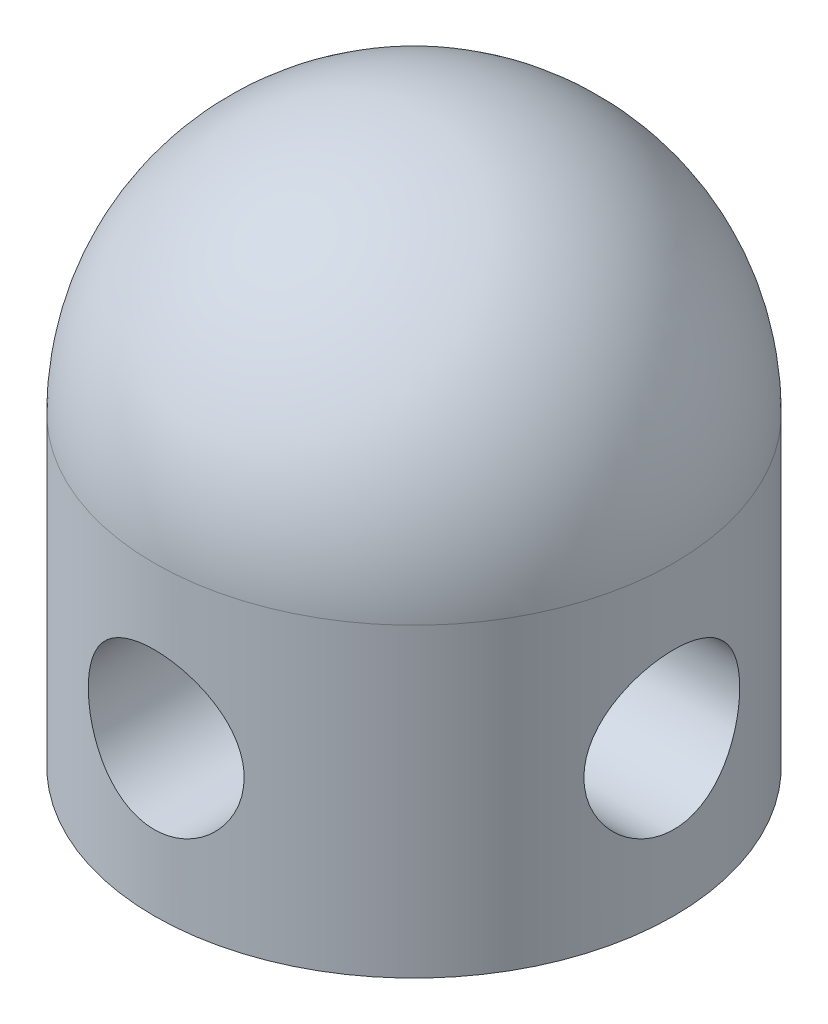
ISO-10303-21;
HEADER;
FILE_DESCRIPTION(('STEP AP214'),'2;1');
FILE_NAME('part.step','',(''),(''),'','','');
FILE_SCHEMA(('AUTOMOTIVE_DESIGN { 1 0 10303 214 1 1 1 1 }'));
ENDSEC;
DATA;
#1=APPLICATION_CONTEXT('core data for automotive mechanical design processes');
#2=APPLICATION_PROTOCOL_DEFINITION('international standard','automotive_design',2000,#1);
#3=PRODUCT_CONTEXT('',#1,'mechanical');
#4=PRODUCT('Part','Part','',(#3));
#5=PRODUCT_RELATED_PRODUCT_CATEGORY('part','',(#4));
#6=PRODUCT_DEFINITION_FORMATION('','',#4);
#7=PRODUCT_DEFINITION_CONTEXT('part definition',#1,'design');
#8=PRODUCT_DEFINITION('design','',#6,#7);
#9=PRODUCT_DEFINITION_SHAPE('','',#8);
#10=(LENGTH_UNIT() NAMED_UNIT(*) SI_UNIT(.MILLI.,.METRE.));
#11=(NAMED_UNIT(*) PLANE_ANGLE_UNIT() SI_UNIT($,.RADIAN.));
#12=(NAMED_UNIT(*) SI_UNIT($,.STERADIAN.) SOLID_ANGLE_UNIT());
#13=UNCERTAINTY_MEASURE_WITH_UNIT(LENGTH_MEASURE(1.E-05),#10,'distance_accuracy_value','');
#14=(GEOMETRIC_REPRESENTATION_CONTEXT(3) GLOBAL_UNCERTAINTY_ASSIGNED_CONTEXT((#13)) GLOBAL_UNIT_ASSIGNED_CONTEXT((#10,
#11,#12)) REPRESENTATION_CONTEXT('',''));
#15=CARTESIAN_POINT('',(0.,0.,0.));
#16=DIRECTION('',(0.,0.,1.));
#17=DIRECTION('',(1.,0.,0.));
#18=AXIS2_PLACEMENT_3D('',#15,#16,#17);
#19=CARTESIAN_POINT('',(0.,20.,0.));
#20=DIRECTION('',(0.,-1.,0.));
#21=DIRECTION('',(0.,0.,-1.));
#22=AXIS2_PLACEMENT_3D('',#19,#20,#21);
#23=CYLINDRICAL_SURFACE('',#22,17.);
#24=CARTESIAN_POINT('',(16.2169664240881,10.,-5.10000000000006));
#25=CARTESIAN_POINT('',(16.2169693147474,9.72053853699297,-5.09999651955021));
#26=CARTESIAN_POINT('',(16.2242692671164,9.44104263790955,-5.07695167768347));
#27=CARTESIAN_POINT('',(16.2525636622905,8.89022215138816,-4.98561871118894));
#28=CARTESIAN_POINT('',(16.2735626807757,8.61890032589522,-4.91731546950155));
#29=CARTESIAN_POINT('',(16.3266674845136,8.09248192387591,-4.73799361117869));
#30=CARTESIAN_POINT('',(16.3587547879105,7.83735917924745,-4.62704603940437));
#31=CARTESIAN_POINT('',(16.4303957066167,7.34928542441603,-4.3658183452096));
#32=CARTESIAN_POINT('',(16.4699504393945,7.11633774047293,-4.21553233465984));
#33=CARTESIAN_POINT('',(16.5534733143162,6.67185427203691,-3.87480164081538));
#34=CARTESIAN_POINT('',(16.5975354825956,6.46112394698262,-3.68332904397749));
#35=CARTESIAN_POINT('',(16.6843053058497,6.07423096550347,-3.26786320777069));
#36=CARTESIAN_POINT('',(16.7270127861219,5.89807275247041,-3.04386579456784));
#37=CARTESIAN_POINT('',(16.8073292956992,5.58182682056676,-2.5639788884986));
#38=CARTESIAN_POINT('',(16.8448146276417,5.44256035689445,-2.30752567254183));
#39=CARTESIAN_POINT('',(16.9093708213033,5.20944331925463,-1.77352379425586));
#40=CARTESIAN_POINT('',(16.9364439288429,5.11558295048468,-1.49597969651896));
#41=CARTESIAN_POINT('',(16.976459964122,4.97860799629227,-0.93610109894488));
#42=CARTESIAN_POINT('',(16.9897849505574,4.93411856598081,-0.654130756442985));
#43=CARTESIAN_POINT('',(17.0021488510459,4.89280109620211,-0.0864342007477273));
#44=CARTESIAN_POINT('',(17.0011907657169,4.89596304603335,0.199291210971204));
#45=CARTESIAN_POINT('',(16.9853665298002,4.94893575304626,0.756741932440475));
#46=CARTESIAN_POINT('',(16.9709442869781,4.99725765895348,1.02862330998046));
#47=CARTESIAN_POINT('',(16.9303517518289,5.13674654238066,1.56022332570457));
#48=CARTESIAN_POINT('',(16.9041807155228,5.22791623320535,1.81994119249776));
#49=CARTESIAN_POINT('',(16.8424175135539,5.45152087962283,2.32338090959415));
#50=CARTESIAN_POINT('',(16.8067191689971,5.58442408954371,2.56688121996063));
#51=CARTESIAN_POINT('',(16.7296877820452,5.88735269825698,3.02859989086321));
#52=CARTESIAN_POINT('',(16.688353403725,6.0573869040796,3.2468122345672));
#53=CARTESIAN_POINT('',(16.6025927165555,6.43747235255154,3.66064563719917));
#54=CARTESIAN_POINT('',(16.5581086407696,6.64881352468632,3.85507157335578));
#55=CARTESIAN_POINT('',(16.4724553163351,7.10153406084096,4.20606015236189));
#56=CARTESIAN_POINT('',(16.4312863973771,7.34291640637865,4.36261903244663));
#57=CARTESIAN_POINT('',(16.3566487081151,7.85201419540269,4.63467584138164));
#58=CARTESIAN_POINT('',(16.3232575613944,8.11995995574973,4.74976563397936));
#59=CARTESIAN_POINT('',(16.2688773443844,8.67266450852362,4.93283433776251));
#60=CARTESIAN_POINT('',(16.2478842285429,8.95741778315959,5.00082861775135));
#61=CARTESIAN_POINT('',(16.2215648849761,9.52428002655414,5.0855421896179));
#62=CARTESIAN_POINT('',(16.2156838749486,9.8060919612504,5.10407817693366));
#63=CARTESIAN_POINT('',(16.2187205428718,10.3688078600227,5.09442220591754));
#64=CARTESIAN_POINT('',(16.2276361492834,10.649711945682,5.06623678862344));
#65=CARTESIAN_POINT('',(16.2587169909066,11.1950604851038,4.96555596152409));
#66=CARTESIAN_POINT('',(16.2805320012653,11.4597429584967,4.89423068866392));
#67=CARTESIAN_POINT('',(16.3345908018511,11.97336574877,4.71065164342945));
#68=CARTESIAN_POINT('',(16.3668362022056,12.2223036280777,4.59839155165364));
#69=CARTESIAN_POINT('',(16.4391983907866,12.7047593778455,4.33268362068108));
#70=CARTESIAN_POINT('',(16.479503216374,12.9376840513517,4.17821118187276));
#71=CARTESIAN_POINT('',(16.5630389919968,13.3749695610147,3.83368025441299));
#72=CARTESIAN_POINT('',(16.6062706408199,13.5793235398835,3.64361324818642));
#73=CARTESIAN_POINT('',(16.6927635406376,13.9616133797701,3.22474745047819));
#74=CARTESIAN_POINT('',(16.7359643321422,14.1382611385557,2.99475762391522));
#75=CARTESIAN_POINT('',(16.8158849594541,14.4504867834944,2.50737006760678));
#76=CARTESIAN_POINT('',(16.8526051170804,14.586066709257,2.24997369984935));
#77=CARTESIAN_POINT('',(16.9152029961486,14.8110001039322,1.71678071599769));
#78=CARTESIAN_POINT('',(16.9411614164488,14.9006988549405,1.4411397149286));
#79=CARTESIAN_POINT('',(16.9796673062922,15.0322071242274,0.877777886115537));
#80=CARTESIAN_POINT('',(16.9922186128101,15.0740303442246,0.590060539006121));
#81=CARTESIAN_POINT('',(17.0022624987674,15.1075583497853,0.0226173232012794));
#82=CARTESIAN_POINT('',(17.0003163737844,15.1011311643867,-0.256989608893115));
#83=CARTESIAN_POINT('',(16.9829069918118,15.0428064495029,-0.810966235959078));
#84=CARTESIAN_POINT('',(16.9674445012379,14.9909114981663,-1.08533622697843));
#85=CARTESIAN_POINT('',(16.924899724181,14.8442803512415,-1.61818176434051));
#86=CARTESIAN_POINT('',(16.8979439986215,14.7500101857942,-1.87679635299416));
#87=CARTESIAN_POINT('',(16.8352000633492,14.5217214906747,-2.37467300835767));
#88=CARTESIAN_POINT('',(16.7994104023277,14.3876964290238,-2.61393188657438));
#89=CARTESIAN_POINT('',(16.7213348381292,14.0787302447412,-3.07462643422755));
#90=CARTESIAN_POINT('',(16.6788777152854,13.9026171380099,-3.29524685025187));
#91=CARTESIAN_POINT('',(16.592800265335,13.516584679656,-3.70442774258546));
#92=CARTESIAN_POINT('',(16.5491796062288,13.3066555910995,-3.89297895268098));
#93=CARTESIAN_POINT('',(16.4641831410189,12.8514413537876,-4.23831315938304));
#94=CARTESIAN_POINT('',(16.4229129898929,12.6052889186445,-4.3939818316433));
#95=CARTESIAN_POINT('',(16.3489866136246,12.089112408027,-4.66154665985053));
#96=CARTESIAN_POINT('',(16.3163262518719,11.8190998798043,-4.77346384891451));
#97=CARTESIAN_POINT('',(16.2665457687777,11.2928825325027,-4.94026604614784));
#98=CARTESIAN_POINT('',(16.2481292646796,11.038330600425,-5.00000120638931));
#99=CARTESIAN_POINT('',(16.2233394482018,10.522528243524,-5.07986584038757));
#100=CARTESIAN_POINT('',(16.2169637215005,10.2612791722088,-5.10000325400526));
#101=CARTESIAN_POINT('',(16.2169664240881,10.,-5.10000000000006));
#102=B_SPLINE_CURVE_WITH_KNOTS('',3,(#24,#25,#26,#27,#28,#29,#30,#31,#32,#33,#34,#35,#36,#37,
#38,#39,#40,#41,#42,#43,#44,#45,#46,#47,#48,#49,#50,#51,#52,#53,#54,#55,#56,#57,#58,#59,#60,#61,
#62,#63,#64,#65,#66,#67,#68,#69,#70,#71,#72,#73,#74,#75,#76,#77,#78,#79,#80,#81,#82,#83,#84,#85,
#86,#87,#88,#89,#90,#91,#92,#93,#94,#95,#96,#97,#98,#99,#100,#101),.UNSPECIFIED.,.T.,.F.,(4,2,2,
2,2,2,2,2,2,2,2,2,2,2,2,2,2,2,2,2,2,2,2,2,2,2,2,2,2,2,2,2,2,2,2,2,2,2,4),(0.,0.837420564112844,
1.6751209817426,2.51143180918506,3.34786788625834,4.20828710027145,5.06881682762327,
5.94714193530391,6.82527748998781,7.67829276508496,8.53112883944897,9.35680428368992,
10.1825320202728,11.017877117413,11.8534205640882,12.7211729987914,13.5890116247233,
14.4651721004139,15.3410465214545,16.1842747469591,17.0273849297397,17.8485922280083,
18.6699263556453,19.5133048816078,20.3568854816719,21.232303207509,22.1076774491114,
22.9763633217756,23.8448005190257,24.67979433307,25.5147408037122,26.340721293744,
27.1668375727954,28.0193873199412,28.8721829895048,29.7503957488581,30.6281857949063,
31.4112792312854,32.1942156312733),.UNSPECIFIED.);
#103=CARTESIAN_POINT('',(16.2169664240881,10.,-5.10000000000006));
#104=VERTEX_POINT('',#103);
#105=EDGE_CURVE('E10',#104,#104,#102,.T.);
#106=ORIENTED_EDGE('',*,*,#105,.T.);
#107=EDGE_LOOP('',(#106));
#108=FACE_BOUND('',#107,.T.);
#109=CARTESIAN_POINT('',(0.,15.1,-17.));
#110=CARTESIAN_POINT('',(-0.279781283361213,15.0999966085514,-16.9999975945186));
#111=CARTESIAN_POINT('',(-0.559596882395174,15.0769008636785,-16.9930271335941));
#112=CARTESIAN_POINT('',(-1.11107962603662,14.9853473956448,-16.9659015901859));
#113=CARTESIAN_POINT('',(-1.38274431499892,14.9168761427205,-16.9457425752509));
#114=CARTESIAN_POINT('',(-1.90989120636529,14.7370635425052,-16.8944487850611));
#115=CARTESIAN_POINT('',(-2.16539663894391,14.6257854432961,-16.8633302085095));
#116=CARTESIAN_POINT('',(-2.654122215581,14.3637772836097,-16.7933517140849));
#117=CARTESIAN_POINT('',(-2.8873393893982,14.2130419748537,-16.7544907665489));
#118=CARTESIAN_POINT('',(-3.33156411042338,13.8718383745949,-16.6719250645352));
#119=CARTESIAN_POINT('',(-3.54184144222564,13.6804434719952,-16.6281210442669));
#120=CARTESIAN_POINT('',(-3.92784731139813,13.2653286182981,-16.5411983632274));
#121=CARTESIAN_POINT('',(-4.10357003515212,13.041603238748,-16.4980798189033));
#122=CARTESIAN_POINT('',(-4.41932128258908,12.561999439696,-16.4163598755112));
#123=CARTESIAN_POINT('',(-4.558458506686,12.3055112327279,-16.3778818255282));
#124=CARTESIAN_POINT('',(-4.79132742227216,11.7714365357169,-16.3112830923696));
#125=CARTESIAN_POINT('',(-4.88507001726103,11.4938551306756,-16.2831599224074));
#126=CARTESIAN_POINT('',(-5.02185554522633,10.9336730951322,-16.2414896087455));
#127=CARTESIAN_POINT('',(-5.06624467198061,10.6514306708506,-16.2275563570039));
#128=CARTESIAN_POINT('',(-5.10726684089727,10.083187268875,-16.2146948515223));
#129=CARTESIAN_POINT('',(-5.10391145388652,9.79718721862276,-16.2157629622189));
#130=CARTESIAN_POINT('',(-5.05059722478317,9.2404947106987,-16.2324412979583));
#131=CARTESIAN_POINT('',(-5.00232497888911,8.96962234867081,-16.2475252110391));
#132=CARTESIAN_POINT('',(-4.86327229447819,8.44001272657822,-16.2896841104336));
#133=CARTESIAN_POINT('',(-4.77248766080649,8.18127666690593,-16.3167602801381));
#134=CARTESIAN_POINT('',(-4.54974490623814,7.67915881118311,-16.3802729249148));
#135=CARTESIAN_POINT('',(-4.41723977578132,7.43603591456006,-16.4168325480405));
#136=CARTESIAN_POINT('',(-4.11519756801175,6.9749111251574,-16.495133557904));
#137=CARTESIAN_POINT('',(-3.94565151608705,6.75691533999098,-16.5368761993709));
#138=CARTESIAN_POINT('',(-3.56596388602956,6.34266695141139,-16.6229743841578));
#139=CARTESIAN_POINT('',(-3.35442268538797,6.14770254229972,-16.6673662465644));
#140=CARTESIAN_POINT('',(-2.90109508166722,5.79571645418095,-16.7522162981433));
#141=CARTESIAN_POINT('',(-2.65930677632695,5.63869716339079,-16.7926742396239));
#142=CARTESIAN_POINT('',(-2.1500071303656,5.36627626362008,-16.865467442364));
#143=CARTESIAN_POINT('',(-1.88233434914305,5.25116044475052,-16.8977464847232));
#144=CARTESIAN_POINT('',(-1.33023441305195,5.06796139366121,-16.950139742295));
#145=CARTESIAN_POINT('',(-1.04581195540457,4.99986504298952,-16.9702573503578));
#146=CARTESIAN_POINT('',(-0.479237625072331,4.91478259514207,-16.9955243978804));
#147=CARTESIAN_POINT('',(-0.197370331844035,4.89605060827453,-17.0011849142049));
#148=CARTESIAN_POINT('',(0.365498659799505,4.90533512942107,-16.9983993902198));
#149=CARTESIAN_POINT('',(0.646500468748656,4.9333453968149,-16.9899552330437));
#150=CARTESIAN_POINT('',(1.19307225805297,5.03390767777909,-16.9602436975635));
#151=CARTESIAN_POINT('',(1.45884742688818,5.10543951777496,-16.9392702131801));
#152=CARTESIAN_POINT('',(1.97456577244537,5.28978699144588,-16.8869278266122));
#153=CARTESIAN_POINT('',(2.22450704188699,5.40260758752873,-16.8555576749172));
#154=CARTESIAN_POINT('',(2.70788644416758,5.66926076263585,-16.7847682479447));
#155=CARTESIAN_POINT('',(2.94080900907887,5.82398175922313,-16.7451795482078));
#156=CARTESIAN_POINT('',(3.37797924713251,6.16896416377954,-16.662497937988));
#157=CARTESIAN_POINT('',(3.5822197100102,6.35923448041801,-16.6194041506611));
#158=CARTESIAN_POINT('',(3.96391531473489,6.77811684845585,-16.5326078435461));
#159=CARTESIAN_POINT('',(4.14012836187102,7.00787037762421,-16.4889400511137));
#160=CARTESIAN_POINT('',(4.45158583245331,7.49463499264571,-16.4076015181251));
#161=CARTESIAN_POINT('',(4.5868313302024,7.75164536349679,-16.3699306203231));
#162=CARTESIAN_POINT('',(4.81158980232337,8.28481047026707,-16.3052844468473));
#163=CARTESIAN_POINT('',(4.90131579585836,8.56086903422863,-16.2782594864495));
#164=CARTESIAN_POINT('',(5.0327388477152,9.1251390943628,-16.2381142085755));
#165=CARTESIAN_POINT('',(5.07445236528343,9.41334639066233,-16.2249891261796));
#166=CARTESIAN_POINT('',(5.10754747248881,9.98082916252063,-16.2145990640065));
#167=CARTESIAN_POINT('',(5.10095388047007,10.259976413568,-16.2166960099067));
#168=CARTESIAN_POINT('',(5.04245518510638,10.8129879515621,-16.2349796406672));
#169=CARTESIAN_POINT('',(4.99055189623993,11.0868524496137,-16.2511657613103));
#170=CARTESIAN_POINT('',(4.84421421934766,11.6182143570477,-16.2953759656171));
#171=CARTESIAN_POINT('',(4.75031596724221,11.8758727770196,-16.3232505547839));
#172=CARTESIAN_POINT('',(4.5230712421165,12.3719842919905,-16.3876694826895));
#173=CARTESIAN_POINT('',(4.38971721873728,12.6104336999814,-16.4242154805464));
#174=CARTESIAN_POINT('',(4.08165796937298,13.0707545961893,-16.5035209985408));
#175=CARTESIAN_POINT('',(3.90562338716193,13.2917057882846,-16.5464583655859));
#176=CARTESIAN_POINT('',(3.51959277741244,13.7015884942475,-16.6328448952841));
#177=CARTESIAN_POINT('',(3.30958793825726,13.8905116741906,-16.6762941880082));
#178=CARTESIAN_POINT('',(2.85418359142308,14.2364796018029,-16.7603318434067));
#179=CARTESIAN_POINT('',(2.60792881168807,14.3924309193086,-16.8007994320342));
#180=CARTESIAN_POINT('',(2.09148067154399,14.6604995776737,-16.8728631354964));
#181=CARTESIAN_POINT('',(1.82129858019644,14.7726374201333,-16.904463397656));
#182=CARTESIAN_POINT('',(1.29457622302796,14.9398439372193,-16.9524739489565));
#183=CARTESIAN_POINT('',(1.0396756706444,14.999739687803,-16.9701489309564));
#184=CARTESIAN_POINT('',(0.523192663784646,15.0798159858214,-16.9939121128127));
#185=CARTESIAN_POINT('',(0.261611333517667,15.1000031711964,-17.0000022492612));
#186=CARTESIAN_POINT('',(0.,15.1,-17.));
#187=B_SPLINE_CURVE_WITH_KNOTS('',3,(#109,#110,#111,#112,#113,#114,#115,#116,#117,#118,#119,
#120,#121,#122,#123,#124,#125,#126,#127,#128,#129,#130,#131,#132,#133,#134,#135,#136,#137,#138,
#139,#140,#141,#142,#143,#144,#145,#146,#147,#148,#149,#150,#151,#152,#153,#154,#155,#156,#157,
#158,#159,#160,#161,#162,#163,#164,#165,#166,#167,#168,#169,#170,#171,#172,#173,#174,#175,#176,
#177,#178,#179,#180,#181,#182,#183,#184,#185,#186),.UNSPECIFIED.,.T.,.F.,(4,2,2,2,2,2,2,2,2,2,2,
2,2,2,2,2,2,2,2,2,2,2,2,2,2,2,2,2,2,2,2,2,2,2,2,2,2,2,4),(0.,0.838382892282875,1.6770158804764,
2.51441449942297,3.35192455900318,4.21109050023851,5.07040086781352,5.94903035415395,
6.82744869450187,7.68126943815663,8.5348832628813,9.3576845677823,10.1805670844594,
11.0147224992894,11.8490802454782,12.718281537725,13.5875375221437,14.4626155940647,
15.3374494200668,16.1808995209979,17.0242370207984,17.8485293872864,18.6729208562741,
19.5163843939862,20.3600595880938,21.2343736110631,22.1086647046785,22.9788257084299,
23.8486883217369,24.6823052860425,25.5158888687368,26.3391213739349,27.162511517048,
28.01589547336,28.8695011467574,29.7480618695692,30.6262109944804,31.410277525878,
32.1942129765041),.UNSPECIFIED.);
#188=CARTESIAN_POINT('',(0.,15.1,-17.));
#189=VERTEX_POINT('',#188);
#190=EDGE_CURVE('E38',#189,#189,#187,.T.);
#191=ORIENTED_EDGE('',*,*,#190,.T.);
#192=EDGE_LOOP('',(#191));
#193=FACE_BOUND('',#192,.T.);
#194=CARTESIAN_POINT('',(-16.216966424088,10.,5.10000000000017));
#195=CARTESIAN_POINT('',(-16.2169693147474,9.72053853699297,5.09999651955033));
#196=CARTESIAN_POINT('',(-16.2242692671164,9.44104263790955,5.07695167768359));
#197=CARTESIAN_POINT('',(-16.2525636622905,8.89022215138816,4.98561871118906));
#198=CARTESIAN_POINT('',(-16.2735626807757,8.61890032589522,4.91731546950167));
#199=CARTESIAN_POINT('',(-16.3266674845136,8.09248192387591,4.73799361117881));
#200=CARTESIAN_POINT('',(-16.3587547879104,7.83735917924745,4.62704603940449));
#201=CARTESIAN_POINT('',(-16.4303957066167,7.34928542441603,4.36581834520972));
#202=CARTESIAN_POINT('',(-16.4699504393945,7.11633774047292,4.21553233465995));
#203=CARTESIAN_POINT('',(-16.5534733143161,6.67185427203691,3.8748016408155));
#204=CARTESIAN_POINT('',(-16.5975354825956,6.46112394698262,3.6833290439776));
#205=CARTESIAN_POINT('',(-16.6843053058497,6.07423096550347,3.26786320777081));
#206=CARTESIAN_POINT('',(-16.7270127861219,5.89807275247041,3.04386579456795));
#207=CARTESIAN_POINT('',(-16.8073292956992,5.58182682056676,2.56397888849872));
#208=CARTESIAN_POINT('',(-16.8448146276417,5.44256035689445,2.30752567254195));
#209=CARTESIAN_POINT('',(-16.9093708213033,5.20944331925463,1.77352379425598));
#210=CARTESIAN_POINT('',(-16.9364439288428,5.11558295048467,1.49597969651908));
#211=CARTESIAN_POINT('',(-16.976459964122,4.97860799629227,0.936101098945));
#212=CARTESIAN_POINT('',(-16.9897849505574,4.93411856598081,0.654130756443105));
#213=CARTESIAN_POINT('',(-17.0021488510459,4.89280109620211,0.0864342007478476));
#214=CARTESIAN_POINT('',(-17.0011907657169,4.89596304603335,-0.199291210971084));
#215=CARTESIAN_POINT('',(-16.9853665298002,4.94893575304626,-0.756741932440355));
#216=CARTESIAN_POINT('',(-16.9709442869781,4.99725765895348,-1.02862330998034));
#217=CARTESIAN_POINT('',(-16.9303517518289,5.13674654238066,-1.56022332570445));
#218=CARTESIAN_POINT('',(-16.9041807155228,5.22791623320535,-1.81994119249764));
#219=CARTESIAN_POINT('',(-16.8424175135539,5.45152087962283,-2.32338090959403));
#220=CARTESIAN_POINT('',(-16.8067191689972,5.58442408954371,-2.56688121996051));
#221=CARTESIAN_POINT('',(-16.7296877820453,5.88735269825698,-3.02859989086309));
#222=CARTESIAN_POINT('',(-16.6883534037251,6.05738690407959,-3.24681223456708));
#223=CARTESIAN_POINT('',(-16.6025927165555,6.43747235255154,-3.66064563719905));
#224=CARTESIAN_POINT('',(-16.5581086407696,6.64881352468632,-3.85507157335567));
#225=CARTESIAN_POINT('',(-16.4724553163351,7.10153406084096,-4.20606015236177));
#226=CARTESIAN_POINT('',(-16.4312863973772,7.34291640637865,-4.36261903244651));
#227=CARTESIAN_POINT('',(-16.3566487081152,7.85201419540269,-4.63467584138152));
#228=CARTESIAN_POINT('',(-16.3232575613944,8.11995995574973,-4.74976563397925));
#229=CARTESIAN_POINT('',(-16.2688773443845,8.67266450852362,-4.9328343377624));
#230=CARTESIAN_POINT('',(-16.2478842285429,8.95741778315959,-5.00082861775123));
#231=CARTESIAN_POINT('',(-16.2215648849761,9.52428002655414,-5.08554218961778));
#232=CARTESIAN_POINT('',(-16.2156838749487,9.8060919612504,-5.10407817693355));
#233=CARTESIAN_POINT('',(-16.2187205428719,10.3688078600227,-5.09442220591743));
#234=CARTESIAN_POINT('',(-16.2276361492834,10.649711945682,-5.06623678862333));
#235=CARTESIAN_POINT('',(-16.2587169909067,11.1950604851038,-4.96555596152397));
#236=CARTESIAN_POINT('',(-16.2805320012653,11.4597429584967,-4.89423068866381));
#237=CARTESIAN_POINT('',(-16.3345908018512,11.97336574877,-4.71065164342934));
#238=CARTESIAN_POINT('',(-16.3668362022057,12.2223036280777,-4.59839155165353));
#239=CARTESIAN_POINT('',(-16.4391983907866,12.7047593778455,-4.33268362068096));
#240=CARTESIAN_POINT('',(-16.479503216374,12.9376840513517,-4.17821118187264));
#241=CARTESIAN_POINT('',(-16.5630389919968,13.3749695610147,-3.83368025441287));
#242=CARTESIAN_POINT('',(-16.6062706408199,13.5793235398835,-3.6436132481863));
#243=CARTESIAN_POINT('',(-16.6927635406376,13.9616133797701,-3.22474745047807));
#244=CARTESIAN_POINT('',(-16.7359643321422,14.1382611385557,-2.99475762391511));
#245=CARTESIAN_POINT('',(-16.8158849594541,14.4504867834944,-2.50737006760667));
#246=CARTESIAN_POINT('',(-16.8526051170804,14.586066709257,-2.24997369984923));
#247=CARTESIAN_POINT('',(-16.9152029961486,14.8110001039322,-1.71678071599758));
#248=CARTESIAN_POINT('',(-16.9411614164488,14.9006988549405,-1.44113971492848));
#249=CARTESIAN_POINT('',(-16.9796673062922,15.0322071242274,-0.87777788611542));
#250=CARTESIAN_POINT('',(-16.9922186128101,15.0740303442246,-0.590060539006004));
#251=CARTESIAN_POINT('',(-17.0022624987674,15.1075583497853,-0.0226173232011619));
#252=CARTESIAN_POINT('',(-17.0003163737844,15.1011311643867,0.256989608893232));
#253=CARTESIAN_POINT('',(-16.9829069918118,15.0428064495029,0.810966235959195));
#254=CARTESIAN_POINT('',(-16.9674445012379,14.9909114981663,1.08533622697854));
#255=CARTESIAN_POINT('',(-16.9248997241809,14.8442803512415,1.61818176434062));
#256=CARTESIAN_POINT('',(-16.8979439986215,14.7500101857942,1.87679635299428));
#257=CARTESIAN_POINT('',(-16.8352000633492,14.5217214906747,2.37467300835778));
#258=CARTESIAN_POINT('',(-16.7994104023277,14.3876964290238,2.61393188657449));
#259=CARTESIAN_POINT('',(-16.7213348381292,14.0787302447412,3.07462643422766));
#260=CARTESIAN_POINT('',(-16.6788777152854,13.9026171380099,3.29524685025199));
#261=CARTESIAN_POINT('',(-16.592800265335,13.516584679656,3.70442774258557));
#262=CARTESIAN_POINT('',(-16.5491796062288,13.3066555910995,3.89297895268109));
#263=CARTESIAN_POINT('',(-16.4641831410189,12.8514413537876,4.23831315938315));
#264=CARTESIAN_POINT('',(-16.4229129898929,12.6052889186445,4.39398183164342));
#265=CARTESIAN_POINT('',(-16.3489866136246,12.089112408027,4.66154665985064));
#266=CARTESIAN_POINT('',(-16.3163262518718,11.8190998798043,4.77346384891463));
#267=CARTESIAN_POINT('',(-16.2665457687776,11.2928825325027,4.94026604614795));
#268=CARTESIAN_POINT('',(-16.2481292646795,11.038330600425,5.00000120638943));
#269=CARTESIAN_POINT('',(-16.2233394482017,10.522528243524,5.07986584038768));
#270=CARTESIAN_POINT('',(-16.2169637215004,10.2612791722088,5.10000325400537));
#271=CARTESIAN_POINT('',(-16.216966424088,10.,5.10000000000017));
#272=B_SPLINE_CURVE_WITH_KNOTS('',3,(#194,#195,#196,#197,#198,#199,#200,#201,#202,#203,#204,
#205,#206,#207,#208,#209,#210,#211,#212,#213,#214,#215,#216,#217,#218,#219,#220,#221,#222,#223,
#224,#225,#226,#227,#228,#229,#230,#231,#232,#233,#234,#235,#236,#237,#238,#239,#240,#241,#242,
#243,#244,#245,#246,#247,#248,#249,#250,#251,#252,#253,#254,#255,#256,#257,#258,#259,#260,#261,
#262,#263,#264,#265,#266,#267,#268,#269,#270,#271),.UNSPECIFIED.,.T.,.F.,(4,2,2,2,2,2,2,2,2,2,2,
2,2,2,2,2,2,2,2,2,2,2,2,2,2,2,2,2,2,2,2,2,2,2,2,2,2,2,4),(0.,0.837420564112842,1.6751209817426,
2.51143180918506,3.34786788625834,4.20828710027145,5.06881682762327,5.94714193530391,
6.82527748998781,7.67829276508496,8.53112883944897,9.35680428368992,10.1825320202728,
11.017877117413,11.8534205640882,12.7211729987914,13.5890116247233,14.4651721004139,
15.3410465214545,16.1842747469591,17.0273849297397,17.8485922280083,18.6699263556453,
19.5133048816078,20.3568854816719,21.232303207509,22.1076774491114,22.9763633217756,
23.8448005190258,24.67979433307,25.5147408037122,26.340721293744,27.1668375727954,
28.0193873199412,28.8721829895048,29.7503957488581,30.6281857949063,31.4112792312854,
32.1942156312733),.UNSPECIFIED.);
#273=CARTESIAN_POINT('',(-16.216966424088,10.,5.10000000000017));
#274=VERTEX_POINT('',#273);
#275=EDGE_CURVE('E42',#274,#274,#272,.T.);
#276=ORIENTED_EDGE('',*,*,#275,.T.);
#277=EDGE_LOOP('',(#276));
#278=FACE_BOUND('',#277,.T.);
#279=CARTESIAN_POINT('',(5.1,10.,16.2169664240881));
#280=CARTESIAN_POINT('',(5.09999651955016,9.72053853699297,16.2169693147474));
#281=CARTESIAN_POINT('',(5.07695167768342,9.44104263790955,16.2242692671164));
#282=CARTESIAN_POINT('',(4.98561871118889,8.89022215138816,16.2525636622905));
#283=CARTESIAN_POINT('',(4.91731546950149,8.61890032589522,16.2735626807757));
#284=CARTESIAN_POINT('',(4.73799361117864,8.09248192387591,16.3266674845137));
#285=CARTESIAN_POINT('',(4.62704603940432,7.83735917924745,16.3587547879105));
#286=CARTESIAN_POINT('',(4.36581834520955,7.34928542441603,16.4303957066167));
#287=CARTESIAN_POINT('',(4.21553233465978,7.11633774047293,16.4699504393945));
#288=CARTESIAN_POINT('',(3.87480164081533,6.67185427203691,16.5534733143162));
#289=CARTESIAN_POINT('',(3.68332904397743,6.46112394698262,16.5975354825957));
#290=CARTESIAN_POINT('',(3.26786320777063,6.07423096550347,16.6843053058497));
#291=CARTESIAN_POINT('',(3.04386579456778,5.89807275247041,16.727012786122));
#292=CARTESIAN_POINT('',(2.56397888849855,5.58182682056676,16.8073292956992));
#293=CARTESIAN_POINT('',(2.30752567254177,5.44256035689445,16.8448146276417));
#294=CARTESIAN_POINT('',(1.7735237942558,5.20944331925463,16.9093708213033));
#295=CARTESIAN_POINT('',(1.4959796965189,5.11558295048467,16.9364439288429));
#296=CARTESIAN_POINT('',(0.936101098944822,4.97860799629227,16.976459964122));
#297=CARTESIAN_POINT('',(0.654130756442926,4.93411856598081,16.9897849505574));
#298=CARTESIAN_POINT('',(0.0864342007476682,4.89280109620211,17.0021488510459));
#299=CARTESIAN_POINT('',(-0.199291210971263,4.89596304603335,17.0011907657169));
#300=CARTESIAN_POINT('',(-0.756741932440534,4.94893575304626,16.9853665298002));
#301=CARTESIAN_POINT('',(-1.02862330998052,4.99725765895348,16.9709442869781));
#302=CARTESIAN_POINT('',(-1.56022332570463,5.13674654238066,16.9303517518289));
#303=CARTESIAN_POINT('',(-1.81994119249782,5.22791623320535,16.9041807155228));
#304=CARTESIAN_POINT('',(-2.32338090959421,5.45152087962283,16.8424175135539));
#305=CARTESIAN_POINT('',(-2.56688121996069,5.58442408954371,16.8067191689971));
#306=CARTESIAN_POINT('',(-3.02859989086327,5.88735269825698,16.7296877820452));
#307=CARTESIAN_POINT('',(-3.24681223456726,6.0573869040796,16.688353403725));
#308=CARTESIAN_POINT('',(-3.66064563719922,6.43747235255154,16.6025927165555));
#309=CARTESIAN_POINT('',(-3.85507157335584,6.64881352468632,16.5581086407696));
#310=CARTESIAN_POINT('',(-4.20606015236195,7.10153406084096,16.472455316335));
#311=CARTESIAN_POINT('',(-4.36261903244668,7.34291640637865,16.4312863973771));
#312=CARTESIAN_POINT('',(-4.63467584138169,7.85201419540269,16.3566487081151));
#313=CARTESIAN_POINT('',(-4.74976563397942,8.11995995574973,16.3232575613943));
#314=CARTESIAN_POINT('',(-4.93283433776257,8.67266450852361,16.2688773443844));
#315=CARTESIAN_POINT('',(-5.0008286177514,8.95741778315959,16.2478842285429));
#316=CARTESIAN_POINT('',(-5.08554218961796,9.52428002655414,16.2215648849761));
#317=CARTESIAN_POINT('',(-5.10407817693372,9.8060919612504,16.2156838749486));
#318=CARTESIAN_POINT('',(-5.0944222059176,10.3688078600227,16.2187205428718));
#319=CARTESIAN_POINT('',(-5.0662367886235,10.649711945682,16.2276361492834));
#320=CARTESIAN_POINT('',(-4.96555596152414,11.1950604851038,16.2587169909066));
#321=CARTESIAN_POINT('',(-4.89423068866398,11.4597429584967,16.2805320012652));
#322=CARTESIAN_POINT('',(-4.71065164342951,11.97336574877,16.3345908018511));
#323=CARTESIAN_POINT('',(-4.5983915516537,12.2223036280777,16.3668362022056));
#324=CARTESIAN_POINT('',(-4.33268362068114,12.7047593778455,16.4391983907866));
#325=CARTESIAN_POINT('',(-4.17821118187282,12.9376840513517,16.4795032163739));
#326=CARTESIAN_POINT('',(-3.83368025441304,13.3749695610147,16.5630389919968));
#327=CARTESIAN_POINT('',(-3.64361324818647,13.5793235398835,16.6062706408199));
#328=CARTESIAN_POINT('',(-3.22474745047824,13.9616133797701,16.6927635406376));
#329=CARTESIAN_POINT('',(-2.99475762391528,14.1382611385557,16.7359643321422));
#330=CARTESIAN_POINT('',(-2.50737006760684,14.4504867834944,16.8158849594541));
#331=CARTESIAN_POINT('',(-2.24997369984941,14.586066709257,16.8526051170804));
#332=CARTESIAN_POINT('',(-1.71678071599776,14.8110001039322,16.9152029961486));
#333=CARTESIAN_POINT('',(-1.44113971492866,14.9006988549405,16.9411614164488));
#334=CARTESIAN_POINT('',(-0.877777886115598,15.0322071242274,16.9796673062921));
#335=CARTESIAN_POINT('',(-0.590060539006182,15.0740303442246,16.9922186128101));
#336=CARTESIAN_POINT('',(-0.0226173232013399,15.1075583497853,17.0022624987674));
#337=CARTESIAN_POINT('',(0.256989608893054,15.1011311643867,17.0003163737844));
#338=CARTESIAN_POINT('',(0.810966235959017,15.0428064495029,16.9829069918118));
#339=CARTESIAN_POINT('',(1.08533622697837,14.9909114981663,16.9674445012379));
#340=CARTESIAN_POINT('',(1.61818176434044,14.8442803512415,16.924899724181));
#341=CARTESIAN_POINT('',(1.8767963529941,14.7500101857942,16.8979439986215));
#342=CARTESIAN_POINT('',(2.37467300835761,14.5217214906747,16.8352000633492));
#343=CARTESIAN_POINT('',(2.61393188657432,14.3876964290238,16.7994104023277));
#344=CARTESIAN_POINT('',(3.07462643422749,14.0787302447412,16.7213348381292));
#345=CARTESIAN_POINT('',(3.29524685025182,13.9026171380099,16.6788777152854));
#346=CARTESIAN_POINT('',(3.7044277425854,13.516584679656,16.592800265335));
#347=CARTESIAN_POINT('',(3.89297895268092,13.3066555910995,16.5491796062288));
#348=CARTESIAN_POINT('',(4.23831315938298,12.8514413537876,16.464183141019));
#349=CARTESIAN_POINT('',(4.39398183164325,12.6052889186445,16.4229129898929));
#350=CARTESIAN_POINT('',(4.66154665985047,12.089112408027,16.3489866136246));
#351=CARTESIAN_POINT('',(4.77346384891446,11.8190998798043,16.3163262518719));
#352=CARTESIAN_POINT('',(4.94026604614778,11.2928825325027,16.2665457687777));
#353=CARTESIAN_POINT('',(5.00000120638926,11.038330600425,16.2481292646796));
#354=CARTESIAN_POINT('',(5.07986584038751,10.522528243524,16.2233394482018));
#355=CARTESIAN_POINT('',(5.1000032540052,10.2612791722088,16.2169637215005));
#356=CARTESIAN_POINT('',(5.1,10.,16.2169664240881));
#357=B_SPLINE_CURVE_WITH_KNOTS('',3,(#279,#280,#281,#282,#283,#284,#285,#286,#287,#288,#289,
#290,#291,#292,#293,#294,#295,#296,#297,#298,#299,#300,#301,#302,#303,#304,#305,#306,#307,#308,
#309,#310,#311,#312,#313,#314,#315,#316,#317,#318,#319,#320,#321,#322,#323,#324,#325,#326,#327,
#328,#329,#330,#331,#332,#333,#334,#335,#336,#337,#338,#339,#340,#341,#342,#343,#344,#345,#346,
#347,#348,#349,#350,#351,#352,#353,#354,#355,#356),.UNSPECIFIED.,.T.,.F.,(4,2,2,2,2,2,2,2,2,2,2,
2,2,2,2,2,2,2,2,2,2,2,2,2,2,2,2,2,2,2,2,2,2,2,2,2,2,2,4),(0.,0.837420564112844,1.6751209817426,
2.51143180918506,3.34786788625834,4.20828710027145,5.06881682762327,5.94714193530391,
6.82527748998782,7.67829276508496,8.53112883944897,9.35680428368992,10.1825320202728,
11.017877117413,11.8534205640882,12.7211729987914,13.5890116247233,14.4651721004139,
15.3410465214545,16.1842747469591,17.0273849297397,17.8485922280083,18.6699263556453,
19.5133048816078,20.3568854816719,21.232303207509,22.1076774491114,22.9763633217756,
23.8448005190257,24.67979433307,25.5147408037122,26.340721293744,27.1668375727954,
28.0193873199412,28.8721829895048,29.7503957488581,30.6281857949063,31.4112792312854,
32.1942156312732),.UNSPECIFIED.);
#358=CARTESIAN_POINT('',(5.1,10.,16.2169664240881));
#359=VERTEX_POINT('',#358);
#360=EDGE_CURVE('E85',#359,#359,#357,.T.);
#361=ORIENTED_EDGE('',*,*,#360,.T.);
#362=EDGE_LOOP('',(#361));
#363=FACE_BOUND('',#362,.T.);
#364=CARTESIAN_POINT('',(0.,20.,0.));
#365=DIRECTION('',(0.,1.,0.));
#366=DIRECTION('',(0.,0.,1.));
#367=AXIS2_PLACEMENT_3D('',#364,#365,#366);
#368=CIRCLE('',#367,17.);
#369=CARTESIAN_POINT('',(0.,20.,17.));
#370=VERTEX_POINT('',#369);
#371=EDGE_CURVE('E91',#370,#370,#368,.T.);
#372=ORIENTED_EDGE('',*,*,#371,.F.);
#373=EDGE_LOOP('',(#372));
#374=FACE_BOUND('',#373,.T.);
#375=CARTESIAN_POINT('',(0.,0.,0.));
#376=DIRECTION('',(0.,1.,0.));
#377=DIRECTION('',(0.,0.,1.));
#378=AXIS2_PLACEMENT_3D('',#375,#376,#377);
#379=CIRCLE('',#378,17.);
#380=CARTESIAN_POINT('',(0.,0.,17.));
#381=VERTEX_POINT('',#380);
#382=EDGE_CURVE('E92',#381,#381,#379,.T.);
#383=ORIENTED_EDGE('',*,*,#382,.T.);
#384=EDGE_LOOP('',(#383));
#385=FACE_BOUND('',#384,.T.);
#386=ADVANCED_FACE('F30',(#108,#193,#278,#363,#374,#385),#23,.T.);
#387=CARTESIAN_POINT('',(0.,0.,0.));
#388=DIRECTION('',(0.,1.,0.));
#389=DIRECTION('',(0.,0.,1.));
#390=AXIS2_PLACEMENT_3D('',#387,#388,#389);
#391=PLANE('',#390);
#392=CARTESIAN_POINT('',(0.,0.,0.));
#393=DIRECTION('',(0.,-1.,0.));
#394=DIRECTION('',(0.,0.,-1.));
#395=AXIS2_PLACEMENT_3D('',#392,#393,#394);
#396=CIRCLE('',#395,13.5);
#397=CARTESIAN_POINT('',(0.,0.,-13.5));
#398=VERTEX_POINT('',#397);
#399=EDGE_CURVE('E111',#398,#398,#396,.T.);
#400=ORIENTED_EDGE('',*,*,#399,.F.);
#401=EDGE_LOOP('',(#400));
#402=FACE_BOUND('',#401,.T.);
#403=ORIENTED_EDGE('',*,*,#382,.F.);
#404=EDGE_LOOP('',(#403));
#405=FACE_BOUND('',#404,.T.);
#406=ADVANCED_FACE('F101',(#402,#405),#391,.F.);
#407=CARTESIAN_POINT('',(0.,20.,0.));
#408=DIRECTION('',(0.,-1.,0.));
#409=DIRECTION('',(-1.,0.,0.));
#410=AXIS2_PLACEMENT_3D('',#407,#408,#409);
#411=SPHERICAL_SURFACE('',#410,17.);
#412=ORIENTED_EDGE('',*,*,#371,.T.);
#413=EDGE_LOOP('',(#412));
#414=FACE_BOUND('',#413,.T.);
#415=ADVANCED_FACE('F98',(#414),#411,.T.);
#416=CARTESIAN_POINT('',(0.,10.,7.));
#417=DIRECTION('',(0.,0.,1.));
#418=DIRECTION('',(1.,0.,0.));
#419=AXIS2_PLACEMENT_3D('',#416,#417,#418);
#420=CYLINDRICAL_SURFACE('',#419,5.1);
#421=CARTESIAN_POINT('',(0.,10.,7.));
#422=DIRECTION('',(0.,0.,1.));
#423=DIRECTION('',(1.,0.,0.));
#424=AXIS2_PLACEMENT_3D('',#421,#422,#423);
#425=CIRCLE('',#424,5.1);
#426=CARTESIAN_POINT('',(5.1,10.,7.));
#427=VERTEX_POINT('',#426);
#428=EDGE_CURVE('E115',#427,#427,#425,.T.);
#429=ORIENTED_EDGE('',*,*,#428,.F.);
#430=EDGE_LOOP('',(#429));
#431=FACE_BOUND('',#430,.T.);
#432=ORIENTED_EDGE('',*,*,#360,.F.);
#433=EDGE_LOOP('',(#432));
#434=FACE_BOUND('',#433,.T.);
#435=ADVANCED_FACE('F94',(#431,#434),#420,.F.);
#436=CARTESIAN_POINT('',(0.,10.,7.));
#437=DIRECTION('',(0.,0.,1.));
#438=DIRECTION('',(1.,0.,0.));
#439=AXIS2_PLACEMENT_3D('',#436,#437,#438);
#440=PLANE('',#439);
#441=ORIENTED_EDGE('',*,*,#428,.T.);
#442=EDGE_LOOP('',(#441));
#443=FACE_BOUND('',#442,.T.);
#444=ADVANCED_FACE('F77',(#443),#440,.T.);
#445=CARTESIAN_POINT('',(-7.,10.,0.));
#446=DIRECTION('',(-1.,0.,0.));
#447=DIRECTION('',(0.,0.,1.));
#448=AXIS2_PLACEMENT_3D('',#445,#446,#447);
#449=CYLINDRICAL_SURFACE('',#448,5.1);
#450=CARTESIAN_POINT('',(-7.,10.,0.));
#451=DIRECTION('',(-1.,0.,0.));
#452=DIRECTION('',(0.,0.,1.));
#453=AXIS2_PLACEMENT_3D('',#450,#451,#452);
#454=CIRCLE('',#453,5.1);
#455=CARTESIAN_POINT('',(-6.99999999999995,10.,5.10000000000007));
#456=VERTEX_POINT('',#455);
#457=EDGE_CURVE('E126',#456,#456,#454,.T.);
#458=ORIENTED_EDGE('',*,*,#457,.F.);
#459=EDGE_LOOP('',(#458));
#460=FACE_BOUND('',#459,.T.);
#461=ORIENTED_EDGE('',*,*,#275,.F.);
#462=EDGE_LOOP('',(#461));
#463=FACE_BOUND('',#462,.T.);
#464=ADVANCED_FACE('F72',(#460,#463),#449,.F.);
#465=CARTESIAN_POINT('',(-7.,10.,0.));
#466=DIRECTION('',(-1.,0.,0.));
#467=DIRECTION('',(0.,0.,1.));
#468=AXIS2_PLACEMENT_3D('',#465,#466,#467);
#469=PLANE('',#468);
#470=ORIENTED_EDGE('',*,*,#457,.T.);
#471=EDGE_LOOP('',(#470));
#472=FACE_BOUND('',#471,.T.);
#473=ADVANCED_FACE('F68',(#472),#469,.T.);
#474=CARTESIAN_POINT('',(0.,10.,-7.));
#475=DIRECTION('',(0.,0.,-1.));
#476=DIRECTION('',(-1.,0.,0.));
#477=AXIS2_PLACEMENT_3D('',#474,#475,#476);
#478=CYLINDRICAL_SURFACE('',#477,5.1);
#479=CARTESIAN_POINT('',(0.,10.,-7.));
#480=DIRECTION('',(0.,0.,-1.));
#481=DIRECTION('',(-1.,0.,0.));
#482=AXIS2_PLACEMENT_3D('',#479,#480,#481);
#483=CIRCLE('',#482,5.1);
#484=CARTESIAN_POINT('',(-5.1,10.,-7.));
#485=VERTEX_POINT('',#484);
#486=EDGE_CURVE('E123',#485,#485,#483,.T.);
#487=ORIENTED_EDGE('',*,*,#486,.F.);
#488=EDGE_LOOP('',(#487));
#489=FACE_BOUND('',#488,.T.);
#490=ORIENTED_EDGE('',*,*,#190,.F.);
#491=EDGE_LOOP('',(#490));
#492=FACE_BOUND('',#491,.T.);
#493=ADVANCED_FACE('F63',(#489,#492),#478,.F.);
#494=CARTESIAN_POINT('',(0.,10.,-7.));
#495=DIRECTION('',(0.,0.,-1.));
#496=DIRECTION('',(-1.,0.,0.));
#497=AXIS2_PLACEMENT_3D('',#494,#495,#496);
#498=PLANE('',#497);
#499=ORIENTED_EDGE('',*,*,#486,.T.);
#500=EDGE_LOOP('',(#499));
#501=FACE_BOUND('',#500,.T.);
#502=ADVANCED_FACE('F59',(#501),#498,.T.);
#503=CARTESIAN_POINT('',(7.,10.,0.));
#504=DIRECTION('',(1.,0.,0.));
#505=DIRECTION('',(0.,0.,-1.));
#506=AXIS2_PLACEMENT_3D('',#503,#504,#505);
#507=CYLINDRICAL_SURFACE('',#506,5.1);
#508=CARTESIAN_POINT('',(7.,10.,0.));
#509=DIRECTION('',(1.,0.,0.));
#510=DIRECTION('',(0.,0.,-1.));
#511=AXIS2_PLACEMENT_3D('',#508,#509,#510);
#512=CIRCLE('',#511,5.1);
#513=CARTESIAN_POINT('',(6.99999999999998,10.,-5.10000000000002));
#514=VERTEX_POINT('',#513);
#515=EDGE_CURVE('E118',#514,#514,#512,.T.);
#516=ORIENTED_EDGE('',*,*,#515,.F.);
#517=EDGE_LOOP('',(#516));
#518=FACE_BOUND('',#517,.T.);
#519=ORIENTED_EDGE('',*,*,#105,.F.);
#520=EDGE_LOOP('',(#519));
#521=FACE_BOUND('',#520,.T.);
#522=ADVANCED_FACE('F53',(#518,#521),#507,.F.);
#523=CARTESIAN_POINT('',(7.,10.,0.));
#524=DIRECTION('',(1.,0.,0.));
#525=DIRECTION('',(0.,0.,-1.));
#526=AXIS2_PLACEMENT_3D('',#523,#524,#525);
#527=PLANE('',#526);
#528=ORIENTED_EDGE('',*,*,#515,.T.);
#529=EDGE_LOOP('',(#528));
#530=FACE_BOUND('',#529,.T.);
#531=ADVANCED_FACE('F58',(#530),#527,.T.);
#532=CARTESIAN_POINT('',(0.,3.,0.));
#533=DIRECTION('',(0.,-1.,0.));
#534=DIRECTION('',(0.,0.,-1.));
#535=AXIS2_PLACEMENT_3D('',#532,#533,#534);
#536=CYLINDRICAL_SURFACE('',#535,13.5);
#537=CARTESIAN_POINT('',(0.,3.,0.));
#538=DIRECTION('',(0.,-1.,0.));
#539=DIRECTION('',(0.,0.,-1.));
#540=AXIS2_PLACEMENT_3D('',#537,#538,#539);
#541=CIRCLE('',#540,13.5);
#542=CARTESIAN_POINT('',(0.,3.,-13.5));
#543=VERTEX_POINT('',#542);
#544=EDGE_CURVE('E129',#543,#543,#541,.T.);
#545=ORIENTED_EDGE('',*,*,#544,.F.);
#546=EDGE_LOOP('',(#545));
#547=FACE_BOUND('',#546,.T.);
#548=ORIENTED_EDGE('',*,*,#399,.T.);
#549=EDGE_LOOP('',(#548));
#550=FACE_BOUND('',#549,.T.);
#551=ADVANCED_FACE('F166',(#547,#550),#536,.F.);
#552=CARTESIAN_POINT('',(0.,3.,0.));
#553=DIRECTION('',(0.,-1.,0.));
#554=DIRECTION('',(0.,0.,-1.));
#555=AXIS2_PLACEMENT_3D('',#552,#553,#554);
#556=PLANE('',#555);
#557=CARTESIAN_POINT('',(0.,3.,0.));
#558=DIRECTION('',(0.,-1.,0.));
#559=DIRECTION('',(0.,0.,-1.));
#560=AXIS2_PLACEMENT_3D('',#557,#558,#559);
#561=CIRCLE('',#560,3.);
#562=CARTESIAN_POINT('',(0.,3.,-3.));
#563=VERTEX_POINT('',#562);
#564=EDGE_CURVE('E138',#563,#563,#561,.T.);
#565=ORIENTED_EDGE('',*,*,#564,.F.);
#566=EDGE_LOOP('',(#565));
#567=FACE_BOUND('',#566,.T.);
#568=ORIENTED_EDGE('',*,*,#544,.T.);
#569=EDGE_LOOP('',(#568));
#570=FACE_BOUND('',#569,.T.);
#571=ADVANCED_FACE('F164',(#567,#570),#556,.T.);
#572=CARTESIAN_POINT('',(0.,5.,0.));
#573=DIRECTION('',(0.,-1.,0.));
#574=DIRECTION('',(0.,0.,-1.));
#575=AXIS2_PLACEMENT_3D('',#572,#573,#574);
#576=PLANE('',#575);
#577=CARTESIAN_POINT('',(0.,5.,0.));
#578=DIRECTION('',(0.,-1.,0.));
#579=DIRECTION('',(0.,0.,-1.));
#580=AXIS2_PLACEMENT_3D('',#577,#578,#579);
#581=CIRCLE('',#580,3.);
#582=CARTESIAN_POINT('',(0.,5.,-3.));
#583=VERTEX_POINT('',#582);
#584=EDGE_CURVE('E141',#583,#583,#581,.T.);
#585=ORIENTED_EDGE('',*,*,#584,.T.);
#586=EDGE_LOOP('',(#585));
#587=FACE_BOUND('',#586,.T.);
#588=CARTESIAN_POINT('',(0.,5.,0.));
#589=DIRECTION('',(0.,-1.,0.));
#590=DIRECTION('',(0.,0.,-1.));
#591=AXIS2_PLACEMENT_3D('',#588,#589,#590);
#592=CIRCLE('',#591,2.);
#593=CARTESIAN_POINT('',(0.,5.,-2.));
#594=VERTEX_POINT('',#593);
#595=EDGE_CURVE('E34',#594,#594,#592,.F.);
#596=ORIENTED_EDGE('',*,*,#595,.T.);
#597=EDGE_LOOP('',(#596));
#598=FACE_BOUND('',#597,.T.);
#599=ADVANCED_FACE('F148',(#587,#598),#576,.T.);
#600=CARTESIAN_POINT('',(0.,5.,0.));
#601=DIRECTION('',(0.,-1.,0.));
#602=DIRECTION('',(0.,0.,-1.));
#603=AXIS2_PLACEMENT_3D('',#600,#601,#602);
#604=CYLINDRICAL_SURFACE('',#603,3.);
#605=ORIENTED_EDGE('',*,*,#584,.F.);
#606=EDGE_LOOP('',(#605));
#607=FACE_BOUND('',#606,.T.);
#608=ORIENTED_EDGE('',*,*,#564,.T.);
#609=EDGE_LOOP('',(#608));
#610=FACE_BOUND('',#609,.T.);
#611=ADVANCED_FACE('F158',(#607,#610),#604,.F.);
#612=CARTESIAN_POINT('',(0.,11.,0.));
#613=DIRECTION('',(0.,-1.,0.));
#614=DIRECTION('',(0.,0.,-1.));
#615=AXIS2_PLACEMENT_3D('',#612,#613,#614);
#616=PLANE('',#615);
#617=CARTESIAN_POINT('',(0.,11.,0.));
#618=DIRECTION('',(0.,-1.,0.));
#619=DIRECTION('',(0.,0.,-1.));
#620=AXIS2_PLACEMENT_3D('',#617,#618,#619);
#621=CIRCLE('',#620,2.);
#622=CARTESIAN_POINT('',(0.,11.,-2.));
#623=VERTEX_POINT('',#622);
#624=EDGE_CURVE('E133',#623,#623,#621,.T.);
#625=ORIENTED_EDGE('',*,*,#624,.T.);
#626=EDGE_LOOP('',(#625));
#627=FACE_BOUND('',#626,.T.);
#628=ADVANCED_FACE('F152',(#627),#616,.T.);
#629=CARTESIAN_POINT('',(0.,11.,0.));
#630=DIRECTION('',(0.,-1.,0.));
#631=DIRECTION('',(0.,0.,-1.));
#632=AXIS2_PLACEMENT_3D('',#629,#630,#631);
#633=CYLINDRICAL_SURFACE('',#632,2.);
#634=ORIENTED_EDGE('',*,*,#624,.F.);
#635=EDGE_LOOP('',(#634));
#636=FACE_BOUND('',#635,.T.);
#637=ORIENTED_EDGE('',*,*,#595,.F.);
#638=EDGE_LOOP('',(#637));
#639=FACE_BOUND('',#638,.T.);
#640=ADVANCED_FACE('F150',(#636,#639),#633,.F.);
#641=CLOSED_SHELL('',(#386,#406,#415,#435,#444,#464,#473,#493,#502,#522,#531,#551,#571,#599,
#611,#628,#640));
#642=MANIFOLD_SOLID_BREP('B2',#641);
#643=ADVANCED_BREP_SHAPE_REPRESENTATION('',(#18,#642),#14);
#644=SHAPE_DEFINITION_REPRESENTATION(#9,#643);
ENDSEC;
END-ISO-10303-21;
